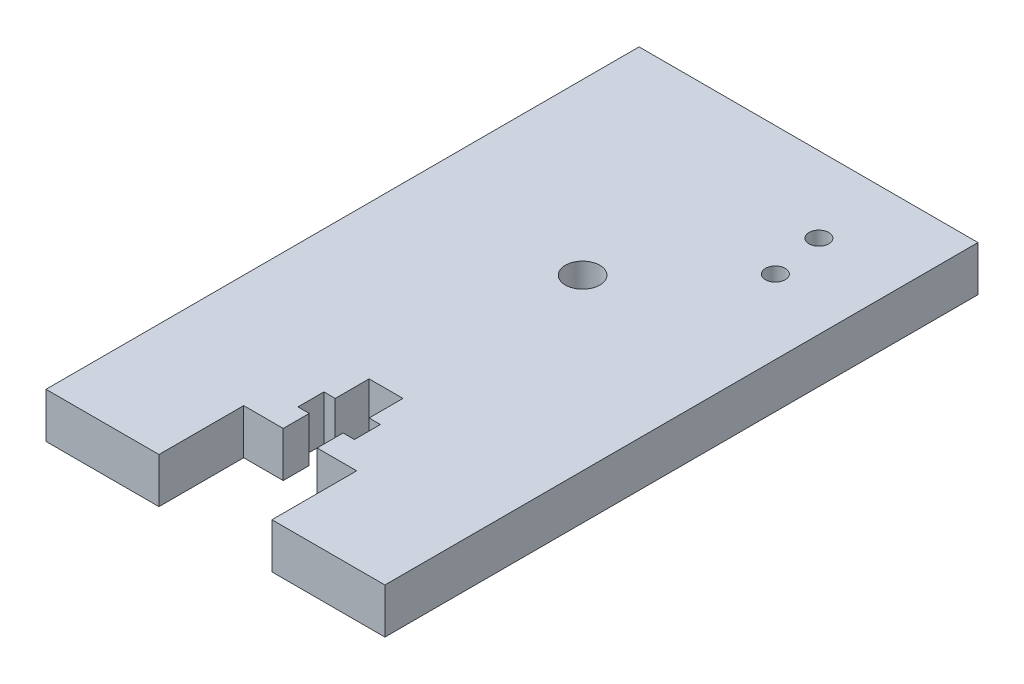
ISO-10303-21;
HEADER;
FILE_DESCRIPTION(('STEP AP214'),'2;1');
FILE_NAME('part.step','',(''),(''),'','','');
FILE_SCHEMA(('AUTOMOTIVE_DESIGN { 1 0 10303 214 1 1 1 1 }'));
ENDSEC;
DATA;
#1=APPLICATION_CONTEXT('core data for automotive mechanical design processes');
#2=APPLICATION_PROTOCOL_DEFINITION('international standard','automotive_design',2000,#1);
#3=PRODUCT_CONTEXT('',#1,'mechanical');
#4=PRODUCT('Part','Part','',(#3));
#5=PRODUCT_RELATED_PRODUCT_CATEGORY('part','',(#4));
#6=PRODUCT_DEFINITION_FORMATION('','',#4);
#7=PRODUCT_DEFINITION_CONTEXT('part definition',#1,'design');
#8=PRODUCT_DEFINITION('design','',#6,#7);
#9=PRODUCT_DEFINITION_SHAPE('','',#8);
#10=(LENGTH_UNIT() NAMED_UNIT(*) SI_UNIT(.MILLI.,.METRE.));
#11=(NAMED_UNIT(*) PLANE_ANGLE_UNIT() SI_UNIT($,.RADIAN.));
#12=(NAMED_UNIT(*) SI_UNIT($,.STERADIAN.) SOLID_ANGLE_UNIT());
#13=UNCERTAINTY_MEASURE_WITH_UNIT(LENGTH_MEASURE(1.E-05),#10,'distance_accuracy_value','');
#14=(GEOMETRIC_REPRESENTATION_CONTEXT(3) GLOBAL_UNCERTAINTY_ASSIGNED_CONTEXT((#13)) GLOBAL_UNIT_ASSIGNED_CONTEXT((#10,
#11,#12)) REPRESENTATION_CONTEXT('',''));
#15=CARTESIAN_POINT('',(0.,0.,0.));
#16=DIRECTION('',(0.,0.,1.));
#17=DIRECTION('',(1.,0.,0.));
#18=AXIS2_PLACEMENT_3D('',#15,#16,#17);
#19=CARTESIAN_POINT('',(0.,8.,0.));
#20=DIRECTION('',(0.,1.,0.));
#21=DIRECTION('',(0.,0.,1.));
#22=AXIS2_PLACEMENT_3D('',#19,#20,#21);
#23=PLANE('',#22);
#24=CARTESIAN_POINT('',(16.8944443199675,8.,-45.2322931275283));
#25=DIRECTION('',(0.,1.,0.));
#26=DIRECTION('',(0.,0.,1.));
#27=AXIS2_PLACEMENT_3D('',#24,#25,#26);
#28=CIRCLE('',#27,1.75);
#29=CARTESIAN_POINT('',(16.8944443199675,8.,-43.4822931275283));
#30=VERTEX_POINT('',#29);
#31=EDGE_CURVE('E607',#30,#30,#28,.T.);
#32=ORIENTED_EDGE('',*,*,#31,.F.);
#33=EDGE_LOOP('',(#32));
#34=FACE_BOUND('',#33,.T.);
#35=DIRECTION('',(0.,0.,1.));
#36=VECTOR('',#35,1.);
#37=CARTESIAN_POINT('',(-30.,8.,-58.));
#38=LINE('',#37,#36);
#39=CARTESIAN_POINT('',(-30.,8.,-68.));
#40=VERTEX_POINT('',#39);
#41=CARTESIAN_POINT('',(-30.,8.,37.));
#42=VERTEX_POINT('',#41);
#43=EDGE_CURVE('E127',#40,#42,#38,.T.);
#44=ORIENTED_EDGE('',*,*,#43,.T.);
#45=DIRECTION('',(1.,0.,0.));
#46=VECTOR('',#45,1.);
#47=CARTESIAN_POINT('',(-10.,8.,37.));
#48=LINE('',#47,#46);
#49=CARTESIAN_POINT('',(-10.,8.,37.));
#50=VERTEX_POINT('',#49);
#51=EDGE_CURVE('E349',#42,#50,#48,.T.);
#52=ORIENTED_EDGE('',*,*,#51,.T.);
#53=DIRECTION('',(0.,0.,-1.));
#54=VECTOR('',#53,1.);
#55=CARTESIAN_POINT('',(-10.,8.,37.));
#56=LINE('',#55,#54);
#57=CARTESIAN_POINT('',(-10.,8.,22.));
#58=VERTEX_POINT('',#57);
#59=EDGE_CURVE('E292',#50,#58,#56,.T.);
#60=ORIENTED_EDGE('',*,*,#59,.T.);
#61=DIRECTION('',(1.,0.,0.));
#62=VECTOR('',#61,1.);
#63=CARTESIAN_POINT('',(-3.,8.,22.));
#64=LINE('',#63,#62);
#65=CARTESIAN_POINT('',(-3.,8.,22.));
#66=VERTEX_POINT('',#65);
#67=EDGE_CURVE('E311',#58,#66,#64,.T.);
#68=ORIENTED_EDGE('',*,*,#67,.T.);
#69=DIRECTION('',(0.,0.,-1.));
#70=VECTOR('',#69,1.);
#71=CARTESIAN_POINT('',(-3.,8.,17.4));
#72=LINE('',#71,#70);
#73=CARTESIAN_POINT('',(-3.,8.,17.4));
#74=VERTEX_POINT('',#73);
#75=EDGE_CURVE('E308',#66,#74,#72,.T.);
#76=ORIENTED_EDGE('',*,*,#75,.T.);
#77=DIRECTION('',(-1.,0.,0.));
#78=VECTOR('',#77,1.);
#79=CARTESIAN_POINT('',(-5.,8.,17.4));
#80=LINE('',#79,#78);
#81=CARTESIAN_POINT('',(-5.,8.,17.4));
#82=VERTEX_POINT('',#81);
#83=EDGE_CURVE('E310',#74,#82,#80,.T.);
#84=ORIENTED_EDGE('',*,*,#83,.T.);
#85=DIRECTION('',(0.,0.,-1.));
#86=VECTOR('',#85,1.);
#87=CARTESIAN_POINT('',(-5.,8.,12.8));
#88=LINE('',#87,#86);
#89=CARTESIAN_POINT('',(-5.,8.,12.8));
#90=VERTEX_POINT('',#89);
#91=EDGE_CURVE('E313',#82,#90,#88,.T.);
#92=ORIENTED_EDGE('',*,*,#91,.T.);
#93=DIRECTION('',(1.,0.,0.));
#94=VECTOR('',#93,1.);
#95=CARTESIAN_POINT('',(-5.,8.,12.8));
#96=LINE('',#95,#94);
#97=CARTESIAN_POINT('',(-3.,8.,12.8));
#98=VERTEX_POINT('',#97);
#99=EDGE_CURVE('E319',#90,#98,#96,.T.);
#100=ORIENTED_EDGE('',*,*,#99,.T.);
#101=DIRECTION('',(0.,0.,-1.));
#102=VECTOR('',#101,1.);
#103=CARTESIAN_POINT('',(-3.,8.,6.80000000000001));
#104=LINE('',#103,#102);
#105=CARTESIAN_POINT('',(-3.,8.,6.80000000000001));
#106=VERTEX_POINT('',#105);
#107=EDGE_CURVE('E321',#98,#106,#104,.T.);
#108=ORIENTED_EDGE('',*,*,#107,.T.);
#109=DIRECTION('',(1.,0.,0.));
#110=VECTOR('',#109,1.);
#111=CARTESIAN_POINT('',(3.,8.,6.80000000000001));
#112=LINE('',#111,#110);
#113=CARTESIAN_POINT('',(3.,8.,6.80000000000001));
#114=VERTEX_POINT('',#113);
#115=EDGE_CURVE('E323',#106,#114,#112,.T.);
#116=ORIENTED_EDGE('',*,*,#115,.T.);
#117=DIRECTION('',(0.,0.,1.));
#118=VECTOR('',#117,1.);
#119=CARTESIAN_POINT('',(3.,8.,12.8));
#120=LINE('',#119,#118);
#121=CARTESIAN_POINT('',(3.,8.,12.8));
#122=VERTEX_POINT('',#121);
#123=EDGE_CURVE('E325',#114,#122,#120,.T.);
#124=ORIENTED_EDGE('',*,*,#123,.T.);
#125=DIRECTION('',(1.,0.,0.));
#126=VECTOR('',#125,1.);
#127=CARTESIAN_POINT('',(3.,8.,12.8));
#128=LINE('',#127,#126);
#129=CARTESIAN_POINT('',(5.,8.,12.8));
#130=VERTEX_POINT('',#129);
#131=EDGE_CURVE('E327',#122,#130,#128,.T.);
#132=ORIENTED_EDGE('',*,*,#131,.T.);
#133=DIRECTION('',(0.,0.,1.));
#134=VECTOR('',#133,1.);
#135=CARTESIAN_POINT('',(5.,8.,12.8));
#136=LINE('',#135,#134);
#137=CARTESIAN_POINT('',(5.,8.,17.4));
#138=VERTEX_POINT('',#137);
#139=EDGE_CURVE('E329',#130,#138,#136,.T.);
#140=ORIENTED_EDGE('',*,*,#139,.T.);
#141=DIRECTION('',(-1.,0.,0.));
#142=VECTOR('',#141,1.);
#143=CARTESIAN_POINT('',(5.,8.,17.4));
#144=LINE('',#143,#142);
#145=CARTESIAN_POINT('',(3.,8.,17.4));
#146=VERTEX_POINT('',#145);
#147=EDGE_CURVE('E331',#138,#146,#144,.T.);
#148=ORIENTED_EDGE('',*,*,#147,.T.);
#149=DIRECTION('',(0.,0.,1.));
#150=VECTOR('',#149,1.);
#151=CARTESIAN_POINT('',(3.,8.,17.4));
#152=LINE('',#151,#150);
#153=CARTESIAN_POINT('',(3.,8.,22.));
#154=VERTEX_POINT('',#153);
#155=EDGE_CURVE('E333',#146,#154,#152,.T.);
#156=ORIENTED_EDGE('',*,*,#155,.T.);
#157=DIRECTION('',(1.,0.,0.));
#158=VECTOR('',#157,1.);
#159=CARTESIAN_POINT('',(10.,8.,22.));
#160=LINE('',#159,#158);
#161=CARTESIAN_POINT('',(10.,8.,22.));
#162=VERTEX_POINT('',#161);
#163=EDGE_CURVE('E335',#154,#162,#160,.T.);
#164=ORIENTED_EDGE('',*,*,#163,.T.);
#165=DIRECTION('',(0.,0.,1.));
#166=VECTOR('',#165,1.);
#167=CARTESIAN_POINT('',(10.,8.,37.));
#168=LINE('',#167,#166);
#169=CARTESIAN_POINT('',(10.,8.,37.));
#170=VERTEX_POINT('',#169);
#171=EDGE_CURVE('E183',#162,#170,#168,.T.);
#172=ORIENTED_EDGE('',*,*,#171,.T.);
#173=DIRECTION('',(1.,0.,0.));
#174=VECTOR('',#173,1.);
#175=CARTESIAN_POINT('',(10.,8.,37.));
#176=LINE('',#175,#174);
#177=CARTESIAN_POINT('',(30.,8.,37.));
#178=VERTEX_POINT('',#177);
#179=EDGE_CURVE('E177',#170,#178,#176,.T.);
#180=ORIENTED_EDGE('',*,*,#179,.T.);
#181=DIRECTION('',(0.,0.,-1.));
#182=VECTOR('',#181,1.);
#183=CARTESIAN_POINT('',(30.,8.,37.));
#184=LINE('',#183,#182);
#185=CARTESIAN_POINT('',(30.,8.,-68.));
#186=VERTEX_POINT('',#185);
#187=EDGE_CURVE('E181',#178,#186,#184,.T.);
#188=ORIENTED_EDGE('',*,*,#187,.T.);
#189=DIRECTION('',(-1.,0.,0.));
#190=VECTOR('',#189,1.);
#191=CARTESIAN_POINT('',(30.,8.,-68.));
#192=LINE('',#191,#190);
#193=EDGE_CURVE('E50',#186,#40,#192,.T.);
#194=ORIENTED_EDGE('',*,*,#193,.T.);
#195=EDGE_LOOP('',(#44,#52,#60,#68,#76,#84,#92,#100,#108,#116,#124,#132,#140,#148,#156,#164,
#172,#180,#188,#194));
#196=FACE_BOUND('',#195,.T.);
#197=CARTESIAN_POINT('',(0.,8.,-28.));
#198=DIRECTION('',(0.,1.,0.));
#199=DIRECTION('',(0.,0.,1.));
#200=AXIS2_PLACEMENT_3D('',#197,#198,#199);
#201=CIRCLE('',#200,3.05);
#202=CARTESIAN_POINT('',(0.,8.,-24.95));
#203=VERTEX_POINT('',#202);
#204=EDGE_CURVE('E204',#203,#203,#201,.T.);
#205=ORIENTED_EDGE('',*,*,#204,.F.);
#206=EDGE_LOOP('',(#205));
#207=FACE_BOUND('',#206,.T.);
#208=CARTESIAN_POINT('',(15.2447866321317,8.,-54.5879667811443));
#209=DIRECTION('',(0.,1.,0.));
#210=DIRECTION('',(0.,0.,-1.));
#211=AXIS2_PLACEMENT_3D('',#208,#209,#210);
#212=CIRCLE('',#211,1.75);
#213=CARTESIAN_POINT('',(15.2447866321317,8.,-56.3379667811443));
#214=VERTEX_POINT('',#213);
#215=EDGE_CURVE('E598',#214,#214,#212,.T.);
#216=ORIENTED_EDGE('',*,*,#215,.F.);
#217=EDGE_LOOP('',(#216));
#218=FACE_BOUND('',#217,.T.);
#219=ADVANCED_FACE('F33',(#34,#196,#207,#218),#23,.T.);
#220=CARTESIAN_POINT('',(0.,0.,0.));
#221=DIRECTION('',(0.,1.,0.));
#222=DIRECTION('',(0.,0.,1.));
#223=AXIS2_PLACEMENT_3D('',#220,#221,#222);
#224=PLANE('',#223);
#225=CARTESIAN_POINT('',(16.8944443199675,0.,-45.2322931275283));
#226=DIRECTION('',(0.,1.,0.));
#227=DIRECTION('',(0.,0.,1.));
#228=AXIS2_PLACEMENT_3D('',#225,#226,#227);
#229=CIRCLE('',#228,1.75);
#230=CARTESIAN_POINT('',(16.8944443199675,0.,-43.4822931275283));
#231=VERTEX_POINT('',#230);
#232=EDGE_CURVE('E604',#231,#231,#229,.T.);
#233=ORIENTED_EDGE('',*,*,#232,.T.);
#234=EDGE_LOOP('',(#233));
#235=FACE_BOUND('',#234,.T.);
#236=DIRECTION('',(0.,0.,1.));
#237=VECTOR('',#236,1.);
#238=CARTESIAN_POINT('',(-30.,0.,37.));
#239=LINE('',#238,#237);
#240=CARTESIAN_POINT('',(-30.,0.,-68.));
#241=VERTEX_POINT('',#240);
#242=CARTESIAN_POINT('',(-30.,0.,37.));
#243=VERTEX_POINT('',#242);
#244=EDGE_CURVE('E121',#241,#243,#239,.T.);
#245=ORIENTED_EDGE('',*,*,#244,.F.);
#246=DIRECTION('',(-1.,0.,0.));
#247=VECTOR('',#246,1.);
#248=CARTESIAN_POINT('',(30.,0.,-68.));
#249=LINE('',#248,#247);
#250=CARTESIAN_POINT('',(30.,0.,-68.));
#251=VERTEX_POINT('',#250);
#252=EDGE_CURVE('E238',#251,#241,#249,.T.);
#253=ORIENTED_EDGE('',*,*,#252,.F.);
#254=DIRECTION('',(0.,0.,-1.));
#255=VECTOR('',#254,1.);
#256=CARTESIAN_POINT('',(30.,0.,-58.));
#257=LINE('',#256,#255);
#258=CARTESIAN_POINT('',(30.,0.,37.));
#259=VERTEX_POINT('',#258);
#260=EDGE_CURVE('E114',#259,#251,#257,.T.);
#261=ORIENTED_EDGE('',*,*,#260,.F.);
#262=DIRECTION('',(1.,0.,0.));
#263=VECTOR('',#262,1.);
#264=CARTESIAN_POINT('',(10.,0.,37.));
#265=LINE('',#264,#263);
#266=CARTESIAN_POINT('',(10.,0.,37.));
#267=VERTEX_POINT('',#266);
#268=EDGE_CURVE('E192',#267,#259,#265,.T.);
#269=ORIENTED_EDGE('',*,*,#268,.F.);
#270=DIRECTION('',(0.,0.,1.));
#271=VECTOR('',#270,1.);
#272=CARTESIAN_POINT('',(10.,0.,37.));
#273=LINE('',#272,#271);
#274=CARTESIAN_POINT('',(10.,0.,22.));
#275=VERTEX_POINT('',#274);
#276=EDGE_CURVE('E234',#275,#267,#273,.T.);
#277=ORIENTED_EDGE('',*,*,#276,.F.);
#278=DIRECTION('',(1.,0.,0.));
#279=VECTOR('',#278,1.);
#280=CARTESIAN_POINT('',(10.,0.,22.));
#281=LINE('',#280,#279);
#282=CARTESIAN_POINT('',(3.,0.,22.));
#283=VERTEX_POINT('',#282);
#284=EDGE_CURVE('E232',#283,#275,#281,.T.);
#285=ORIENTED_EDGE('',*,*,#284,.F.);
#286=DIRECTION('',(0.,0.,1.));
#287=VECTOR('',#286,1.);
#288=CARTESIAN_POINT('',(3.,0.,17.4));
#289=LINE('',#288,#287);
#290=CARTESIAN_POINT('',(3.,0.,17.4));
#291=VERTEX_POINT('',#290);
#292=EDGE_CURVE('E230',#291,#283,#289,.T.);
#293=ORIENTED_EDGE('',*,*,#292,.F.);
#294=DIRECTION('',(-1.,0.,0.));
#295=VECTOR('',#294,1.);
#296=CARTESIAN_POINT('',(5.,0.,17.4));
#297=LINE('',#296,#295);
#298=CARTESIAN_POINT('',(5.,0.,17.4));
#299=VERTEX_POINT('',#298);
#300=EDGE_CURVE('E228',#299,#291,#297,.T.);
#301=ORIENTED_EDGE('',*,*,#300,.F.);
#302=DIRECTION('',(0.,0.,1.));
#303=VECTOR('',#302,1.);
#304=CARTESIAN_POINT('',(5.,0.,12.8));
#305=LINE('',#304,#303);
#306=CARTESIAN_POINT('',(5.,0.,12.8));
#307=VERTEX_POINT('',#306);
#308=EDGE_CURVE('E226',#307,#299,#305,.T.);
#309=ORIENTED_EDGE('',*,*,#308,.F.);
#310=DIRECTION('',(1.,0.,0.));
#311=VECTOR('',#310,1.);
#312=CARTESIAN_POINT('',(3.,0.,12.8));
#313=LINE('',#312,#311);
#314=CARTESIAN_POINT('',(3.,0.,12.8));
#315=VERTEX_POINT('',#314);
#316=EDGE_CURVE('E224',#315,#307,#313,.T.);
#317=ORIENTED_EDGE('',*,*,#316,.F.);
#318=DIRECTION('',(0.,0.,1.));
#319=VECTOR('',#318,1.);
#320=CARTESIAN_POINT('',(3.,0.,12.8));
#321=LINE('',#320,#319);
#322=CARTESIAN_POINT('',(3.,0.,6.80000000000001));
#323=VERTEX_POINT('',#322);
#324=EDGE_CURVE('E222',#323,#315,#321,.T.);
#325=ORIENTED_EDGE('',*,*,#324,.F.);
#326=DIRECTION('',(1.,0.,0.));
#327=VECTOR('',#326,1.);
#328=CARTESIAN_POINT('',(3.,0.,6.80000000000001));
#329=LINE('',#328,#327);
#330=CARTESIAN_POINT('',(-3.,0.,6.80000000000001));
#331=VERTEX_POINT('',#330);
#332=EDGE_CURVE('E220',#331,#323,#329,.T.);
#333=ORIENTED_EDGE('',*,*,#332,.F.);
#334=DIRECTION('',(0.,0.,-1.));
#335=VECTOR('',#334,1.);
#336=CARTESIAN_POINT('',(-3.,0.,6.80000000000001));
#337=LINE('',#336,#335);
#338=CARTESIAN_POINT('',(-3.,0.,12.8));
#339=VERTEX_POINT('',#338);
#340=EDGE_CURVE('E218',#339,#331,#337,.T.);
#341=ORIENTED_EDGE('',*,*,#340,.F.);
#342=DIRECTION('',(1.,0.,0.));
#343=VECTOR('',#342,1.);
#344=CARTESIAN_POINT('',(-5.,0.,12.8));
#345=LINE('',#344,#343);
#346=CARTESIAN_POINT('',(-5.,0.,12.8));
#347=VERTEX_POINT('',#346);
#348=EDGE_CURVE('E216',#347,#339,#345,.T.);
#349=ORIENTED_EDGE('',*,*,#348,.F.);
#350=DIRECTION('',(0.,0.,-1.));
#351=VECTOR('',#350,1.);
#352=CARTESIAN_POINT('',(-5.,0.,12.8));
#353=LINE('',#352,#351);
#354=CARTESIAN_POINT('',(-5.,0.,17.4));
#355=VERTEX_POINT('',#354);
#356=EDGE_CURVE('E214',#355,#347,#353,.T.);
#357=ORIENTED_EDGE('',*,*,#356,.F.);
#358=DIRECTION('',(-1.,0.,0.));
#359=VECTOR('',#358,1.);
#360=CARTESIAN_POINT('',(-5.,0.,17.4));
#361=LINE('',#360,#359);
#362=CARTESIAN_POINT('',(-3.,0.,17.4));
#363=VERTEX_POINT('',#362);
#364=EDGE_CURVE('E212',#363,#355,#361,.T.);
#365=ORIENTED_EDGE('',*,*,#364,.F.);
#366=DIRECTION('',(0.,0.,-1.));
#367=VECTOR('',#366,1.);
#368=CARTESIAN_POINT('',(-3.,0.,17.4));
#369=LINE('',#368,#367);
#370=CARTESIAN_POINT('',(-3.,0.,22.));
#371=VERTEX_POINT('',#370);
#372=EDGE_CURVE('E210',#371,#363,#369,.T.);
#373=ORIENTED_EDGE('',*,*,#372,.F.);
#374=DIRECTION('',(1.,0.,0.));
#375=VECTOR('',#374,1.);
#376=CARTESIAN_POINT('',(-3.,0.,22.));
#377=LINE('',#376,#375);
#378=CARTESIAN_POINT('',(-10.,0.,22.));
#379=VERTEX_POINT('',#378);
#380=EDGE_CURVE('E208',#379,#371,#377,.T.);
#381=ORIENTED_EDGE('',*,*,#380,.F.);
#382=DIRECTION('',(0.,0.,-1.));
#383=VECTOR('',#382,1.);
#384=CARTESIAN_POINT('',(-10.,0.,37.));
#385=LINE('',#384,#383);
#386=CARTESIAN_POINT('',(-10.,0.,37.));
#387=VERTEX_POINT('',#386);
#388=EDGE_CURVE('E206',#387,#379,#385,.T.);
#389=ORIENTED_EDGE('',*,*,#388,.F.);
#390=DIRECTION('',(1.,0.,0.));
#391=VECTOR('',#390,1.);
#392=CARTESIAN_POINT('',(-10.,0.,37.));
#393=LINE('',#392,#391);
#394=EDGE_CURVE('E203',#243,#387,#393,.T.);
#395=ORIENTED_EDGE('',*,*,#394,.F.);
#396=EDGE_LOOP('',(#245,#253,#261,#269,#277,#285,#293,#301,#309,#317,#325,#333,#341,#349,#357,
#365,#373,#381,#389,#395));
#397=FACE_BOUND('',#396,.T.);
#398=CARTESIAN_POINT('',(0.,0.,-28.));
#399=DIRECTION('',(0.,1.,0.));
#400=DIRECTION('',(0.,0.,1.));
#401=AXIS2_PLACEMENT_3D('',#398,#399,#400);
#402=CIRCLE('',#401,3.05);
#403=CARTESIAN_POINT('',(0.,0.,-24.95));
#404=VERTEX_POINT('',#403);
#405=EDGE_CURVE('E353',#404,#404,#402,.T.);
#406=ORIENTED_EDGE('',*,*,#405,.T.);
#407=EDGE_LOOP('',(#406));
#408=FACE_BOUND('',#407,.T.);
#409=CARTESIAN_POINT('',(15.2447866321317,0.,-54.5879667811443));
#410=DIRECTION('',(0.,1.,0.));
#411=DIRECTION('',(0.,0.,-1.));
#412=AXIS2_PLACEMENT_3D('',#409,#410,#411);
#413=CIRCLE('',#412,1.75);
#414=CARTESIAN_POINT('',(15.2447866321317,0.,-56.3379667811443));
#415=VERTEX_POINT('',#414);
#416=EDGE_CURVE('E601',#415,#415,#413,.T.);
#417=ORIENTED_EDGE('',*,*,#416,.T.);
#418=EDGE_LOOP('',(#417));
#419=FACE_BOUND('',#418,.T.);
#420=ADVANCED_FACE('F296',(#235,#397,#408,#419),#224,.F.);
#421=CARTESIAN_POINT('',(-30.,8.,37.));
#422=DIRECTION('',(1.,0.,0.));
#423=DIRECTION('',(0.,0.,-1.));
#424=AXIS2_PLACEMENT_3D('',#421,#422,#423);
#425=PLANE('',#424);
#426=ORIENTED_EDGE('',*,*,#244,.T.);
#427=DIRECTION('',(0.,-1.,0.));
#428=VECTOR('',#427,1.);
#429=CARTESIAN_POINT('',(-30.,8.,37.));
#430=LINE('',#429,#428);
#431=EDGE_CURVE('E11',#42,#243,#430,.T.);
#432=ORIENTED_EDGE('',*,*,#431,.F.);
#433=ORIENTED_EDGE('',*,*,#43,.F.);
#434=DIRECTION('',(0.,-1.,0.));
#435=VECTOR('',#434,1.);
#436=CARTESIAN_POINT('',(-30.,8.,-68.));
#437=LINE('',#436,#435);
#438=EDGE_CURVE('E198',#40,#241,#437,.T.);
#439=ORIENTED_EDGE('',*,*,#438,.T.);
#440=EDGE_LOOP('',(#426,#432,#433,#439));
#441=FACE_BOUND('',#440,.T.);
#442=ADVANCED_FACE('F35',(#441),#425,.F.);
#443=CARTESIAN_POINT('',(-10.,8.,37.));
#444=DIRECTION('',(0.,0.,-1.));
#445=DIRECTION('',(-1.,0.,0.));
#446=AXIS2_PLACEMENT_3D('',#443,#444,#445);
#447=PLANE('',#446);
#448=ORIENTED_EDGE('',*,*,#394,.T.);
#449=DIRECTION('',(0.,-1.,0.));
#450=VECTOR('',#449,1.);
#451=CARTESIAN_POINT('',(-10.,8.,37.));
#452=LINE('',#451,#450);
#453=EDGE_CURVE('E42',#50,#387,#452,.T.);
#454=ORIENTED_EDGE('',*,*,#453,.F.);
#455=ORIENTED_EDGE('',*,*,#51,.F.);
#456=ORIENTED_EDGE('',*,*,#431,.T.);
#457=EDGE_LOOP('',(#448,#454,#455,#456));
#458=FACE_BOUND('',#457,.T.);
#459=ADVANCED_FACE('F355',(#458),#447,.F.);
#460=CARTESIAN_POINT('',(-10.,8.,37.));
#461=DIRECTION('',(-1.,0.,0.));
#462=DIRECTION('',(0.,0.,1.));
#463=AXIS2_PLACEMENT_3D('',#460,#461,#462);
#464=PLANE('',#463);
#465=ORIENTED_EDGE('',*,*,#388,.T.);
#466=DIRECTION('',(0.,-1.,0.));
#467=VECTOR('',#466,1.);
#468=CARTESIAN_POINT('',(-10.,8.,22.));
#469=LINE('',#468,#467);
#470=EDGE_CURVE('E283',#58,#379,#469,.T.);
#471=ORIENTED_EDGE('',*,*,#470,.F.);
#472=ORIENTED_EDGE('',*,*,#59,.F.);
#473=ORIENTED_EDGE('',*,*,#453,.T.);
#474=EDGE_LOOP('',(#465,#471,#472,#473));
#475=FACE_BOUND('',#474,.T.);
#476=ADVANCED_FACE('F290',(#475),#464,.F.);
#477=CARTESIAN_POINT('',(-3.,8.,22.));
#478=DIRECTION('',(0.,0.,-1.));
#479=DIRECTION('',(-1.,0.,0.));
#480=AXIS2_PLACEMENT_3D('',#477,#478,#479);
#481=PLANE('',#480);
#482=ORIENTED_EDGE('',*,*,#380,.T.);
#483=DIRECTION('',(0.,-1.,0.));
#484=VECTOR('',#483,1.);
#485=CARTESIAN_POINT('',(-3.,8.,22.));
#486=LINE('',#485,#484);
#487=EDGE_CURVE('E280',#66,#371,#486,.T.);
#488=ORIENTED_EDGE('',*,*,#487,.F.);
#489=ORIENTED_EDGE('',*,*,#67,.F.);
#490=ORIENTED_EDGE('',*,*,#470,.T.);
#491=EDGE_LOOP('',(#482,#488,#489,#490));
#492=FACE_BOUND('',#491,.T.);
#493=ADVANCED_FACE('F302',(#492),#481,.F.);
#494=CARTESIAN_POINT('',(-3.,8.,17.4));
#495=DIRECTION('',(-1.,0.,0.));
#496=DIRECTION('',(0.,0.,1.));
#497=AXIS2_PLACEMENT_3D('',#494,#495,#496);
#498=PLANE('',#497);
#499=ORIENTED_EDGE('',*,*,#372,.T.);
#500=DIRECTION('',(0.,-1.,0.));
#501=VECTOR('',#500,1.);
#502=CARTESIAN_POINT('',(-3.,8.,17.4));
#503=LINE('',#502,#501);
#504=EDGE_CURVE('E277',#74,#363,#503,.T.);
#505=ORIENTED_EDGE('',*,*,#504,.F.);
#506=ORIENTED_EDGE('',*,*,#75,.F.);
#507=ORIENTED_EDGE('',*,*,#487,.T.);
#508=EDGE_LOOP('',(#499,#505,#506,#507));
#509=FACE_BOUND('',#508,.T.);
#510=ADVANCED_FACE('F306',(#509),#498,.F.);
#511=CARTESIAN_POINT('',(-5.,8.,17.4));
#512=DIRECTION('',(0.,0.,1.));
#513=DIRECTION('',(1.,0.,0.));
#514=AXIS2_PLACEMENT_3D('',#511,#512,#513);
#515=PLANE('',#514);
#516=ORIENTED_EDGE('',*,*,#364,.T.);
#517=DIRECTION('',(0.,-1.,0.));
#518=VECTOR('',#517,1.);
#519=CARTESIAN_POINT('',(-5.,8.,17.4));
#520=LINE('',#519,#518);
#521=EDGE_CURVE('E274',#82,#355,#520,.T.);
#522=ORIENTED_EDGE('',*,*,#521,.F.);
#523=ORIENTED_EDGE('',*,*,#83,.F.);
#524=ORIENTED_EDGE('',*,*,#504,.T.);
#525=EDGE_LOOP('',(#516,#522,#523,#524));
#526=FACE_BOUND('',#525,.T.);
#527=ADVANCED_FACE('F420',(#526),#515,.F.);
#528=CARTESIAN_POINT('',(-5.,8.,12.8));
#529=DIRECTION('',(-1.,0.,0.));
#530=DIRECTION('',(0.,0.,1.));
#531=AXIS2_PLACEMENT_3D('',#528,#529,#530);
#532=PLANE('',#531);
#533=ORIENTED_EDGE('',*,*,#356,.T.);
#534=DIRECTION('',(0.,-1.,0.));
#535=VECTOR('',#534,1.);
#536=CARTESIAN_POINT('',(-5.,8.,12.8));
#537=LINE('',#536,#535);
#538=EDGE_CURVE('E271',#90,#347,#537,.T.);
#539=ORIENTED_EDGE('',*,*,#538,.F.);
#540=ORIENTED_EDGE('',*,*,#91,.F.);
#541=ORIENTED_EDGE('',*,*,#521,.T.);
#542=EDGE_LOOP('',(#533,#539,#540,#541));
#543=FACE_BOUND('',#542,.T.);
#544=ADVANCED_FACE('F416',(#543),#532,.F.);
#545=CARTESIAN_POINT('',(-5.,8.,12.8));
#546=DIRECTION('',(0.,0.,-1.));
#547=DIRECTION('',(-1.,0.,0.));
#548=AXIS2_PLACEMENT_3D('',#545,#546,#547);
#549=PLANE('',#548);
#550=ORIENTED_EDGE('',*,*,#348,.T.);
#551=DIRECTION('',(0.,-1.,0.));
#552=VECTOR('',#551,1.);
#553=CARTESIAN_POINT('',(-3.,8.,12.8));
#554=LINE('',#553,#552);
#555=EDGE_CURVE('E268',#98,#339,#554,.T.);
#556=ORIENTED_EDGE('',*,*,#555,.F.);
#557=ORIENTED_EDGE('',*,*,#99,.F.);
#558=ORIENTED_EDGE('',*,*,#538,.T.);
#559=EDGE_LOOP('',(#550,#556,#557,#558));
#560=FACE_BOUND('',#559,.T.);
#561=ADVANCED_FACE('F412',(#560),#549,.F.);
#562=CARTESIAN_POINT('',(-3.,8.,6.80000000000001));
#563=DIRECTION('',(-1.,0.,0.));
#564=DIRECTION('',(0.,0.,1.));
#565=AXIS2_PLACEMENT_3D('',#562,#563,#564);
#566=PLANE('',#565);
#567=ORIENTED_EDGE('',*,*,#340,.T.);
#568=DIRECTION('',(0.,-1.,0.));
#569=VECTOR('',#568,1.);
#570=CARTESIAN_POINT('',(-3.,8.,6.80000000000001));
#571=LINE('',#570,#569);
#572=EDGE_CURVE('E265',#106,#331,#571,.T.);
#573=ORIENTED_EDGE('',*,*,#572,.F.);
#574=ORIENTED_EDGE('',*,*,#107,.F.);
#575=ORIENTED_EDGE('',*,*,#555,.T.);
#576=EDGE_LOOP('',(#567,#573,#574,#575));
#577=FACE_BOUND('',#576,.T.);
#578=ADVANCED_FACE('F408',(#577),#566,.F.);
#579=CARTESIAN_POINT('',(3.,8.,6.80000000000001));
#580=DIRECTION('',(0.,0.,-1.));
#581=DIRECTION('',(-1.,0.,0.));
#582=AXIS2_PLACEMENT_3D('',#579,#580,#581);
#583=PLANE('',#582);
#584=ORIENTED_EDGE('',*,*,#332,.T.);
#585=DIRECTION('',(0.,-1.,0.));
#586=VECTOR('',#585,1.);
#587=CARTESIAN_POINT('',(3.,8.,6.80000000000001));
#588=LINE('',#587,#586);
#589=EDGE_CURVE('E262',#114,#323,#588,.T.);
#590=ORIENTED_EDGE('',*,*,#589,.F.);
#591=ORIENTED_EDGE('',*,*,#115,.F.);
#592=ORIENTED_EDGE('',*,*,#572,.T.);
#593=EDGE_LOOP('',(#584,#590,#591,#592));
#594=FACE_BOUND('',#593,.T.);
#595=ADVANCED_FACE('F404',(#594),#583,.F.);
#596=CARTESIAN_POINT('',(3.,8.,12.8));
#597=DIRECTION('',(1.,0.,0.));
#598=DIRECTION('',(0.,0.,-1.));
#599=AXIS2_PLACEMENT_3D('',#596,#597,#598);
#600=PLANE('',#599);
#601=ORIENTED_EDGE('',*,*,#324,.T.);
#602=DIRECTION('',(0.,-1.,0.));
#603=VECTOR('',#602,1.);
#604=CARTESIAN_POINT('',(3.,8.,12.8));
#605=LINE('',#604,#603);
#606=EDGE_CURVE('E259',#122,#315,#605,.T.);
#607=ORIENTED_EDGE('',*,*,#606,.F.);
#608=ORIENTED_EDGE('',*,*,#123,.F.);
#609=ORIENTED_EDGE('',*,*,#589,.T.);
#610=EDGE_LOOP('',(#601,#607,#608,#609));
#611=FACE_BOUND('',#610,.T.);
#612=ADVANCED_FACE('F400',(#611),#600,.F.);
#613=CARTESIAN_POINT('',(3.,8.,12.8));
#614=DIRECTION('',(0.,0.,-1.));
#615=DIRECTION('',(-1.,0.,0.));
#616=AXIS2_PLACEMENT_3D('',#613,#614,#615);
#617=PLANE('',#616);
#618=ORIENTED_EDGE('',*,*,#316,.T.);
#619=DIRECTION('',(0.,-1.,0.));
#620=VECTOR('',#619,1.);
#621=CARTESIAN_POINT('',(5.,8.,12.8));
#622=LINE('',#621,#620);
#623=EDGE_CURVE('E256',#130,#307,#622,.T.);
#624=ORIENTED_EDGE('',*,*,#623,.F.);
#625=ORIENTED_EDGE('',*,*,#131,.F.);
#626=ORIENTED_EDGE('',*,*,#606,.T.);
#627=EDGE_LOOP('',(#618,#624,#625,#626));
#628=FACE_BOUND('',#627,.T.);
#629=ADVANCED_FACE('F396',(#628),#617,.F.);
#630=CARTESIAN_POINT('',(5.,8.,12.8));
#631=DIRECTION('',(1.,0.,0.));
#632=DIRECTION('',(0.,0.,-1.));
#633=AXIS2_PLACEMENT_3D('',#630,#631,#632);
#634=PLANE('',#633);
#635=ORIENTED_EDGE('',*,*,#308,.T.);
#636=DIRECTION('',(0.,-1.,0.));
#637=VECTOR('',#636,1.);
#638=CARTESIAN_POINT('',(5.,8.,17.4));
#639=LINE('',#638,#637);
#640=EDGE_CURVE('E253',#138,#299,#639,.T.);
#641=ORIENTED_EDGE('',*,*,#640,.F.);
#642=ORIENTED_EDGE('',*,*,#139,.F.);
#643=ORIENTED_EDGE('',*,*,#623,.T.);
#644=EDGE_LOOP('',(#635,#641,#642,#643));
#645=FACE_BOUND('',#644,.T.);
#646=ADVANCED_FACE('F392',(#645),#634,.F.);
#647=CARTESIAN_POINT('',(5.,8.,17.4));
#648=DIRECTION('',(0.,0.,1.));
#649=DIRECTION('',(1.,0.,0.));
#650=AXIS2_PLACEMENT_3D('',#647,#648,#649);
#651=PLANE('',#650);
#652=ORIENTED_EDGE('',*,*,#300,.T.);
#653=DIRECTION('',(0.,-1.,0.));
#654=VECTOR('',#653,1.);
#655=CARTESIAN_POINT('',(3.,8.,17.4));
#656=LINE('',#655,#654);
#657=EDGE_CURVE('E250',#146,#291,#656,.T.);
#658=ORIENTED_EDGE('',*,*,#657,.F.);
#659=ORIENTED_EDGE('',*,*,#147,.F.);
#660=ORIENTED_EDGE('',*,*,#640,.T.);
#661=EDGE_LOOP('',(#652,#658,#659,#660));
#662=FACE_BOUND('',#661,.T.);
#663=ADVANCED_FACE('F388',(#662),#651,.F.);
#664=CARTESIAN_POINT('',(3.,8.,17.4));
#665=DIRECTION('',(1.,0.,0.));
#666=DIRECTION('',(0.,0.,-1.));
#667=AXIS2_PLACEMENT_3D('',#664,#665,#666);
#668=PLANE('',#667);
#669=ORIENTED_EDGE('',*,*,#292,.T.);
#670=DIRECTION('',(0.,-1.,0.));
#671=VECTOR('',#670,1.);
#672=CARTESIAN_POINT('',(3.,8.,22.));
#673=LINE('',#672,#671);
#674=EDGE_CURVE('E247',#154,#283,#673,.T.);
#675=ORIENTED_EDGE('',*,*,#674,.F.);
#676=ORIENTED_EDGE('',*,*,#155,.F.);
#677=ORIENTED_EDGE('',*,*,#657,.T.);
#678=EDGE_LOOP('',(#669,#675,#676,#677));
#679=FACE_BOUND('',#678,.T.);
#680=ADVANCED_FACE('F385',(#679),#668,.F.);
#681=CARTESIAN_POINT('',(10.,8.,22.));
#682=DIRECTION('',(0.,0.,-1.));
#683=DIRECTION('',(-1.,0.,0.));
#684=AXIS2_PLACEMENT_3D('',#681,#682,#683);
#685=PLANE('',#684);
#686=ORIENTED_EDGE('',*,*,#284,.T.);
#687=DIRECTION('',(0.,-1.,0.));
#688=VECTOR('',#687,1.);
#689=CARTESIAN_POINT('',(10.,8.,22.));
#690=LINE('',#689,#688);
#691=EDGE_CURVE('E244',#162,#275,#690,.T.);
#692=ORIENTED_EDGE('',*,*,#691,.F.);
#693=ORIENTED_EDGE('',*,*,#163,.F.);
#694=ORIENTED_EDGE('',*,*,#674,.T.);
#695=EDGE_LOOP('',(#686,#692,#693,#694));
#696=FACE_BOUND('',#695,.T.);
#697=ADVANCED_FACE('F341',(#696),#685,.F.);
#698=CARTESIAN_POINT('',(10.,8.,37.));
#699=DIRECTION('',(1.,0.,0.));
#700=DIRECTION('',(0.,0.,-1.));
#701=AXIS2_PLACEMENT_3D('',#698,#699,#700);
#702=PLANE('',#701);
#703=ORIENTED_EDGE('',*,*,#276,.T.);
#704=DIRECTION('',(0.,-1.,0.));
#705=VECTOR('',#704,1.);
#706=CARTESIAN_POINT('',(10.,8.,37.));
#707=LINE('',#706,#705);
#708=EDGE_CURVE('E193',#170,#267,#707,.T.);
#709=ORIENTED_EDGE('',*,*,#708,.F.);
#710=ORIENTED_EDGE('',*,*,#171,.F.);
#711=ORIENTED_EDGE('',*,*,#691,.T.);
#712=EDGE_LOOP('',(#703,#709,#710,#711));
#713=FACE_BOUND('',#712,.T.);
#714=ADVANCED_FACE('F345',(#713),#702,.F.);
#715=CARTESIAN_POINT('',(10.,8.,37.));
#716=DIRECTION('',(0.,0.,-1.));
#717=DIRECTION('',(-1.,0.,0.));
#718=AXIS2_PLACEMENT_3D('',#715,#716,#717);
#719=PLANE('',#718);
#720=ORIENTED_EDGE('',*,*,#268,.T.);
#721=DIRECTION('',(0.,-1.,0.));
#722=VECTOR('',#721,1.);
#723=CARTESIAN_POINT('',(30.,8.,37.));
#724=LINE('',#723,#722);
#725=EDGE_CURVE('E189',#178,#259,#724,.T.);
#726=ORIENTED_EDGE('',*,*,#725,.F.);
#727=ORIENTED_EDGE('',*,*,#179,.F.);
#728=ORIENTED_EDGE('',*,*,#708,.T.);
#729=EDGE_LOOP('',(#720,#726,#727,#728));
#730=FACE_BOUND('',#729,.T.);
#731=ADVANCED_FACE('F190',(#730),#719,.F.);
#732=CARTESIAN_POINT('',(30.,8.,-58.));
#733=DIRECTION('',(-1.,0.,0.));
#734=DIRECTION('',(0.,0.,1.));
#735=AXIS2_PLACEMENT_3D('',#732,#733,#734);
#736=PLANE('',#735);
#737=ORIENTED_EDGE('',*,*,#260,.T.);
#738=DIRECTION('',(0.,-1.,0.));
#739=VECTOR('',#738,1.);
#740=CARTESIAN_POINT('',(30.,8.,-68.));
#741=LINE('',#740,#739);
#742=EDGE_CURVE('E194',#186,#251,#741,.T.);
#743=ORIENTED_EDGE('',*,*,#742,.F.);
#744=ORIENTED_EDGE('',*,*,#187,.F.);
#745=ORIENTED_EDGE('',*,*,#725,.T.);
#746=EDGE_LOOP('',(#737,#743,#744,#745));
#747=FACE_BOUND('',#746,.T.);
#748=ADVANCED_FACE('F196',(#747),#736,.F.);
#749=CARTESIAN_POINT('',(30.,8.,-68.));
#750=DIRECTION('',(0.,0.,1.));
#751=DIRECTION('',(1.,0.,0.));
#752=AXIS2_PLACEMENT_3D('',#749,#750,#751);
#753=PLANE('',#752);
#754=ORIENTED_EDGE('',*,*,#252,.T.);
#755=ORIENTED_EDGE('',*,*,#438,.F.);
#756=ORIENTED_EDGE('',*,*,#193,.F.);
#757=ORIENTED_EDGE('',*,*,#742,.T.);
#758=EDGE_LOOP('',(#754,#755,#756,#757));
#759=FACE_BOUND('',#758,.T.);
#760=ADVANCED_FACE('F347',(#759),#753,.F.);
#761=CARTESIAN_POINT('',(0.,8.,-28.));
#762=DIRECTION('',(0.,-1.,0.));
#763=DIRECTION('',(0.,0.,-1.));
#764=AXIS2_PLACEMENT_3D('',#761,#762,#763);
#765=CYLINDRICAL_SURFACE('',#764,3.05);
#766=ORIENTED_EDGE('',*,*,#204,.T.);
#767=EDGE_LOOP('',(#766));
#768=FACE_BOUND('',#767,.T.);
#769=ORIENTED_EDGE('',*,*,#405,.F.);
#770=EDGE_LOOP('',(#769));
#771=FACE_BOUND('',#770,.T.);
#772=ADVANCED_FACE('F372',(#768,#771),#765,.F.);
#773=CARTESIAN_POINT('',(16.8944443199675,8.,-45.2322931275283));
#774=DIRECTION('',(0.,-1.,0.));
#775=DIRECTION('',(0.,0.,-1.));
#776=AXIS2_PLACEMENT_3D('',#773,#774,#775);
#777=CYLINDRICAL_SURFACE('',#776,1.75);
#778=ORIENTED_EDGE('',*,*,#31,.T.);
#779=EDGE_LOOP('',(#778));
#780=FACE_BOUND('',#779,.T.);
#781=ORIENTED_EDGE('',*,*,#232,.F.);
#782=EDGE_LOOP('',(#781));
#783=FACE_BOUND('',#782,.T.);
#784=ADVANCED_FACE('F502',(#780,#783),#777,.F.);
#785=CARTESIAN_POINT('',(15.2447866321317,8.,-54.5879667811443));
#786=DIRECTION('',(0.,-1.,0.));
#787=DIRECTION('',(0.,0.,-1.));
#788=AXIS2_PLACEMENT_3D('',#785,#786,#787);
#789=CYLINDRICAL_SURFACE('',#788,1.75);
#790=ORIENTED_EDGE('',*,*,#215,.T.);
#791=EDGE_LOOP('',(#790));
#792=FACE_BOUND('',#791,.T.);
#793=ORIENTED_EDGE('',*,*,#416,.F.);
#794=EDGE_LOOP('',(#793));
#795=FACE_BOUND('',#794,.T.);
#796=ADVANCED_FACE('F509',(#792,#795),#789,.F.);
#797=CLOSED_SHELL('',(#219,#420,#442,#459,#476,#493,#510,#527,#544,#561,#578,#595,#612,#629,
#646,#663,#680,#697,#714,#731,#748,#760,#772,#784,#796));
#798=MANIFOLD_SOLID_BREP('B2',#797);
#799=ADVANCED_BREP_SHAPE_REPRESENTATION('',(#18,#798),#14);
#800=SHAPE_DEFINITION_REPRESENTATION(#9,#799);
ENDSEC;
END-ISO-10303-21;
